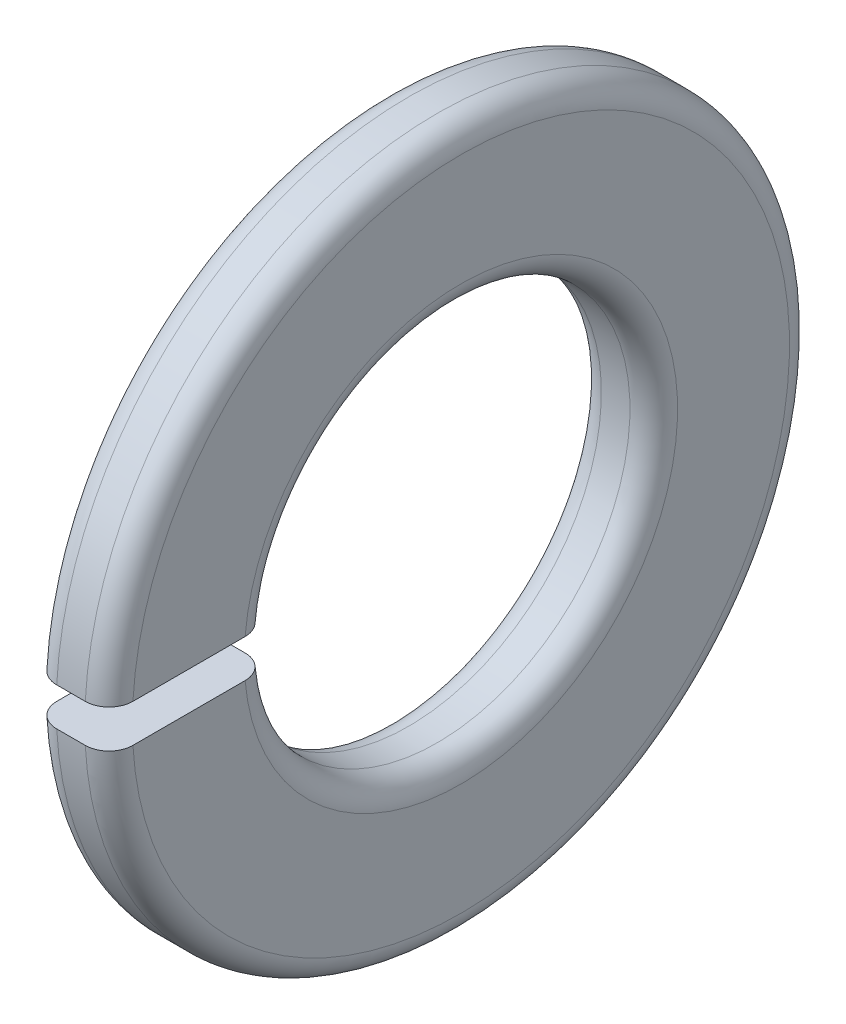
ISO-10303-21;
HEADER;
FILE_DESCRIPTION(('STEP AP214'),'2;1');
FILE_NAME('part.step','',(''),(''),'','','');
FILE_SCHEMA(('AUTOMOTIVE_DESIGN { 1 0 10303 214 1 1 1 1 }'));
ENDSEC;
DATA;
#1=APPLICATION_CONTEXT('core data for automotive mechanical design processes');
#2=APPLICATION_PROTOCOL_DEFINITION('international standard','automotive_design',2000,#1);
#3=PRODUCT_CONTEXT('',#1,'mechanical');
#4=PRODUCT('Part','Part','',(#3));
#5=PRODUCT_RELATED_PRODUCT_CATEGORY('part','',(#4));
#6=PRODUCT_DEFINITION_FORMATION('','',#4);
#7=PRODUCT_DEFINITION_CONTEXT('part definition',#1,'design');
#8=PRODUCT_DEFINITION('design','',#6,#7);
#9=PRODUCT_DEFINITION_SHAPE('','',#8);
#10=(LENGTH_UNIT() NAMED_UNIT(*) SI_UNIT(.MILLI.,.METRE.));
#11=(NAMED_UNIT(*) PLANE_ANGLE_UNIT() SI_UNIT($,.RADIAN.));
#12=(NAMED_UNIT(*) SI_UNIT($,.STERADIAN.) SOLID_ANGLE_UNIT());
#13=UNCERTAINTY_MEASURE_WITH_UNIT(LENGTH_MEASURE(1.E-05),#10,'distance_accuracy_value','');
#14=(GEOMETRIC_REPRESENTATION_CONTEXT(3) GLOBAL_UNCERTAINTY_ASSIGNED_CONTEXT((#13)) GLOBAL_UNIT_ASSIGNED_CONTEXT((#10,
#11,#12)) REPRESENTATION_CONTEXT('',''));
#15=CARTESIAN_POINT('',(0.,0.,0.));
#16=DIRECTION('',(0.,0.,1.));
#17=DIRECTION('',(1.,0.,0.));
#18=AXIS2_PLACEMENT_3D('',#15,#16,#17);
#19=CARTESIAN_POINT('',(-34.9250000000002,-2.22044604925031E-13,0.));
#20=DIRECTION('',(-1.,0.,0.));
#21=DIRECTION('',(0.,0.,1.));
#22=AXIS2_PLACEMENT_3D('',#19,#20,#21);
#23=CYLINDRICAL_SURFACE('',#22,7.4);
#24=DIRECTION('',(-1.,0.,0.));
#25=VECTOR('',#24,1.);
#26=CARTESIAN_POINT('',(-34.9250000000001,0.399999999999845,7.38918128076449));
#27=LINE('',#26,#25);
#28=CARTESIAN_POINT('',(-0.500000000000222,0.399999999999956,7.38918128076449));
#29=VERTEX_POINT('',#28);
#30=CARTESIAN_POINT('',(-1.10000000000027,0.399999999999845,7.38918128076449));
#31=VERTEX_POINT('',#30);
#32=EDGE_CURVE('E195',#29,#31,#27,.T.);
#33=ORIENTED_EDGE('',*,*,#32,.F.);
#34=CARTESIAN_POINT('',(-0.499999999999834,0.,0.));
#35=DIRECTION('',(-1.,0.,0.));
#36=DIRECTION('',(0.,0.,1.));
#37=AXIS2_PLACEMENT_3D('',#34,#35,#36);
#38=CIRCLE('',#37,7.4);
#39=CARTESIAN_POINT('',(-0.500000000000111,-0.4000000000004,7.38918128076449));
#40=VERTEX_POINT('',#39);
#41=EDGE_CURVE('E137',#29,#40,#38,.T.);
#42=ORIENTED_EDGE('',*,*,#41,.T.);
#43=DIRECTION('',(-1.,0.,0.));
#44=VECTOR('',#43,1.);
#45=CARTESIAN_POINT('',(-34.9250000000001,-0.400000000000178,7.38918128076449));
#46=LINE('',#45,#44);
#47=CARTESIAN_POINT('',(-1.09999999999993,-0.400000000000178,7.38918128076449));
#48=VERTEX_POINT('',#47);
#49=EDGE_CURVE('E120',#48,#40,#46,.F.);
#50=ORIENTED_EDGE('',*,*,#49,.F.);
#51=CARTESIAN_POINT('',(-1.09999999999988,-1.11022302462516E-13,0.));
#52=DIRECTION('',(1.,0.,0.));
#53=DIRECTION('',(0.,0.,-1.));
#54=AXIS2_PLACEMENT_3D('',#51,#52,#53);
#55=CIRCLE('',#54,7.4);
#56=EDGE_CURVE('E135',#48,#31,#55,.T.);
#57=ORIENTED_EDGE('',*,*,#56,.T.);
#58=EDGE_LOOP('',(#33,#42,#50,#57));
#59=FACE_BOUND('',#58,.T.);
#60=ADVANCED_FACE('F37',(#59),#23,.T.);
#61=CARTESIAN_POINT('',(2.22044604925031E-13,4.55000000000005,-1.11022302462516E-13));
#62=DIRECTION('',(-1.,0.,0.));
#63=DIRECTION('',(0.,0.,1.));
#64=AXIS2_PLACEMENT_3D('',#61,#62,#63);
#65=PLANE('',#64);
#66=DIRECTION('',(0.,0.,1.));
#67=VECTOR('',#66,1.);
#68=CARTESIAN_POINT('',(0.,-0.400000000000067,0.));
#69=LINE('',#68,#67);
#70=CARTESIAN_POINT('',(0.,-0.399999999999956,4.53238347892149));
#71=VERTEX_POINT('',#70);
#72=CARTESIAN_POINT('',(0.,-0.399999999999956,6.8883960397178));
#73=VERTEX_POINT('',#72);
#74=EDGE_CURVE('E101',#71,#73,#69,.T.);
#75=ORIENTED_EDGE('',*,*,#74,.T.);
#76=CARTESIAN_POINT('',(0.,0.,0.));
#77=DIRECTION('',(-1.,0.,0.));
#78=DIRECTION('',(0.,0.,1.));
#79=AXIS2_PLACEMENT_3D('',#76,#77,#78);
#80=CIRCLE('',#79,6.9);
#81=CARTESIAN_POINT('',(1.11022302462516E-13,0.399999999999956,6.8883960397178));
#82=VERTEX_POINT('',#81);
#83=EDGE_CURVE('E59',#73,#82,#80,.F.);
#84=ORIENTED_EDGE('',*,*,#83,.T.);
#85=DIRECTION('',(0.,0.,-1.));
#86=VECTOR('',#85,1.);
#87=CARTESIAN_POINT('',(1.11022302462516E-13,0.399999999999956,7.548));
#88=LINE('',#87,#86);
#89=CARTESIAN_POINT('',(1.11022302462516E-13,0.399999999999956,4.53238347892138));
#90=VERTEX_POINT('',#89);
#91=EDGE_CURVE('E110',#82,#90,#88,.T.);
#92=ORIENTED_EDGE('',*,*,#91,.T.);
#93=CARTESIAN_POINT('',(0.,0.,0.));
#94=DIRECTION('',(-1.,0.,0.));
#95=DIRECTION('',(0.,0.,1.));
#96=AXIS2_PLACEMENT_3D('',#93,#94,#95);
#97=CIRCLE('',#96,4.55);
#98=EDGE_CURVE('E117',#90,#71,#97,.T.);
#99=ORIENTED_EDGE('',*,*,#98,.T.);
#100=EDGE_LOOP('',(#75,#84,#92,#99));
#101=FACE_BOUND('',#100,.T.);
#102=ADVANCED_FACE('F123',(#101),#65,.F.);
#103=CARTESIAN_POINT('',(-0.499999999999834,0.,0.));
#104=DIRECTION('',(-1.,0.,0.));
#105=DIRECTION('',(0.,0.,1.));
#106=AXIS2_PLACEMENT_3D('',#103,#104,#105);
#107=TOROIDAL_SURFACE('',#106,4.55,0.5);
#108=ORIENTED_EDGE('',*,*,#98,.F.);
#109=CARTESIAN_POINT('',(-0.330409125838482,0.400000000000067,4.05998263665097));
#110=CARTESIAN_POINT('',(-0.356699409802146,0.4000000000001,4.05045896546512));
#111=CARTESIAN_POINT('',(-0.383811711798037,0.400000000000022,4.0431457229356));
#112=CARTESIAN_POINT('',(-0.438901460988715,0.39999999999989,4.0331697398659));
#113=CARTESIAN_POINT('',(-0.466879878970347,0.399999999999836,4.03051242528311));
#114=CARTESIAN_POINT('',(-0.522875623236489,0.399999999999854,4.02993732111443));
#115=CARTESIAN_POINT('',(-0.55089292694413,0.399999999999925,4.03201744362594));
#116=CARTESIAN_POINT('',(-0.606172773373835,0.399999999999987,4.04085230185844));
#117=CARTESIAN_POINT('',(-0.633435494454908,0.399999999999978,4.04760592293036));
#118=CARTESIAN_POINT('',(-0.686443389534853,0.399999999999933,4.06558912296169));
#119=CARTESIAN_POINT('',(-0.712188500806952,0.399999999999897,4.07681888678307));
#120=CARTESIAN_POINT('',(-0.761436770280269,0.400000000000015,4.10342912146019));
#121=CARTESIAN_POINT('',(-0.784939816128844,0.40000000000017,4.11880980017565));
#122=CARTESIAN_POINT('',(-0.829113401635823,0.400000000000186,4.15333154451043));
#123=CARTESIAN_POINT('',(-0.849775233099391,0.400000000000047,4.1724837518144));
#124=CARTESIAN_POINT('',(-0.887607999389916,0.399999999999865,4.21397126810759));
#125=CARTESIAN_POINT('',(-0.904778856858445,0.399999999999821,4.23630664761585));
#126=CARTESIAN_POINT('',(-0.935223661861778,0.399999999999869,4.28363431668719));
#127=CARTESIAN_POINT('',(-0.948479748232837,0.399999999999962,4.30863809632875));
#128=CARTESIAN_POINT('',(-0.970623347165116,0.39999999999995,4.36051051838913));
#129=CARTESIAN_POINT('',(-0.979510773610316,0.399999999999845,4.38737919755738));
#130=CARTESIAN_POINT('',(-0.992694264359808,0.399999999999845,4.44232245499128));
#131=CARTESIAN_POINT('',(-0.996973767275093,0.399999999999952,4.47040100828186));
#132=CARTESIAN_POINT('',(-1.00076411779757,0.39999999999996,4.52687835917844));
#133=CARTESIAN_POINT('',(-1.0002749143817,0.399999999999861,4.5552771602077));
#134=CARTESIAN_POINT('',(-0.99453592985803,0.399999999999829,4.61162260838542));
#135=CARTESIAN_POINT('',(-0.989280734484446,0.399999999999897,4.63956870449149));
#136=CARTESIAN_POINT('',(-0.974146548364361,0.400000000000015,4.69417974747737));
#137=CARTESIAN_POINT('',(-0.96426758016482,0.400000000000066,4.72084470060373));
#138=CARTESIAN_POINT('',(-0.940178144680834,0.400000000000068,4.77209438903106));
#139=CARTESIAN_POINT('',(-0.92597385676707,0.400000000000019,4.79668202848432));
#140=CARTESIAN_POINT('',(-0.893627088301629,0.399999999999892,4.84311401411117));
#141=CARTESIAN_POINT('',(-0.875484665198122,0.399999999999814,4.86495840029507));
#142=CARTESIAN_POINT('',(-0.83583473091054,0.399999999999876,4.90521248540845));
#143=CARTESIAN_POINT('',(-0.814337571269765,0.400000000000015,4.92363238020995));
#144=CARTESIAN_POINT('',(-0.768547265482445,0.399999999999897,4.956587365567));
#145=CARTESIAN_POINT('',(-0.744254170003945,0.399999999999638,4.97112252650596));
#146=CARTESIAN_POINT('',(-0.693647642204003,0.399999999999608,4.99584577571268));
#147=CARTESIAN_POINT('',(-0.66734111827875,0.399999999999833,5.00604800566672));
#148=CARTESIAN_POINT('',(-0.613386245709869,0.400000000000079,5.02187927836136));
#149=CARTESIAN_POINT('',(-0.585737916867112,0.400000000000098,5.02750838856528));
#150=CARTESIAN_POINT('',(-0.529954605037693,0.400000000000036,5.0340224915288));
#151=CARTESIAN_POINT('',(-0.501820931561369,0.399999999999954,5.03491870265947));
#152=CARTESIAN_POINT('',(-0.445803103473787,0.399999999999958,5.03197138887469));
#153=CARTESIAN_POINT('',(-0.417918947108474,0.400000000000045,5.02812789730478));
#154=CARTESIAN_POINT('',(-0.363212088788961,0.400000000000089,5.0158167420571));
#155=CARTESIAN_POINT('',(-0.336388641609307,0.400000000000045,5.00735238907735));
#156=CARTESIAN_POINT('',(-0.284541175591884,0.399999999999867,4.98604553307513));
#157=CARTESIAN_POINT('',(-0.259517162804965,0.399999999999733,4.97320301533129));
#158=CARTESIAN_POINT('',(-0.21194661877391,0.399999999999735,4.94349125113132));
#159=CARTESIAN_POINT('',(-0.18940295534485,0.399999999999871,4.92661741360181));
#160=CARTESIAN_POINT('',(-0.147459087564632,0.400000000000041,4.88933373674696));
#161=CARTESIAN_POINT('',(-0.128058917811661,0.400000000000075,4.86892385850806));
#162=CARTESIAN_POINT('',(-0.092896266127162,0.400000000000059,4.82509033772428));
#163=CARTESIAN_POINT('',(-0.0771436115465001,0.400000000000009,4.8016588122359));
#164=CARTESIAN_POINT('',(-0.0497804542347216,0.399999999999903,4.75249065234609));
#165=CARTESIAN_POINT('',(-0.0381700327053552,0.399999999999847,4.72675397276823));
#166=CARTESIAN_POINT('',(-0.0193802754353022,0.399999999999843,4.67361422413988));
#167=CARTESIAN_POINT('',(-0.0122158509543728,0.399999999999894,4.64620588245273));
#168=CARTESIAN_POINT('',(-0.00257598547450597,0.400000000000018,4.59057656902082));
#169=CARTESIAN_POINT('',(-0.000100635309112921,0.40000000000009,4.56235558154479));
#170=CARTESIAN_POINT('',(9.48808270901258E-05,0.400000000000044,4.50581794311796));
#171=CARTESIAN_POINT('',(-0.00219827880240896,0.399999999999924,4.4775012454532));
#172=CARTESIAN_POINT('',(-0.0115011713229525,0.399999999999988,4.4216543895494));
#173=CARTESIAN_POINT('',(-0.0185107660903179,0.40000000000017,4.39412420830136));
#174=CARTESIAN_POINT('',(-0.0370577853172879,0.400000000000185,4.34060850684111));
#175=CARTESIAN_POINT('',(-0.0485988845907034,0.400000000000017,4.31462426004419));
#176=CARTESIAN_POINT('',(-0.0758904922002047,0.399999999999895,4.26495974515578));
#177=CARTESIAN_POINT('',(-0.0916420238085095,0.39999999999994,4.24128003905364));
#178=CARTESIAN_POINT('',(-0.126885515624021,0.399999999999971,4.19694238067453));
#179=CARTESIAN_POINT('',(-0.146372741198713,0.399999999999957,4.176280661179));
#180=CARTESIAN_POINT('',(-0.188537988577971,0.399999999999955,4.1385587222439));
#181=CARTESIAN_POINT('',(-0.211212066622253,0.399999999999968,4.12149411562191));
#182=CARTESIAN_POINT('',(-0.250142838267282,0.399999999999949,4.0970633538218));
#183=CARTESIAN_POINT('',(-0.265634721029375,0.399999999999932,4.0884549780136));
#184=CARTESIAN_POINT('',(-0.29744424845304,0.39999999999998,4.07292985605947));
#185=CARTESIAN_POINT('',(-0.313761891790958,0.400000000000046,4.06601310720206));
#186=CARTESIAN_POINT('',(-0.330409125838482,0.400000000000067,4.05998263665097));
#187=B_SPLINE_CURVE_WITH_KNOTS('',3,(#109,#110,#111,#112,#113,#114,#115,#116,#117,#118,#119,
#120,#121,#122,#123,#124,#125,#126,#127,#128,#129,#130,#131,#132,#133,#134,#135,#136,#137,#138,
#139,#140,#141,#142,#143,#144,#145,#146,#147,#148,#149,#150,#151,#152,#153,#154,#155,#156,#157,
#158,#159,#160,#161,#162,#163,#164,#165,#166,#167,#168,#169,#170,#171,#172,#173,#174,#175,#176,
#177,#178,#179,#180,#181,#182,#183,#184,#185,#186),.UNSPECIFIED.,.T.,.F.,(4,2,2,2,2,2,2,2,2,2,2,
2,2,2,2,2,2,2,2,2,2,2,2,2,2,2,2,2,2,2,2,2,2,2,2,2,2,2,4),(0.,0.0838218122114619,
0.167741244452596,0.251623698536688,0.335486153194864,0.419352071680105,0.503222190583977,
0.587343895837374,0.671467464987133,0.755969120076795,0.840472440815555,0.925278472375903,
1.0100854113247,1.09498881356317,1.17989180179044,1.26467405791238,1.34945507734284,
1.43397948444906,1.5185023600422,1.60274721209049,1.68699082132428,1.77103465836219,
1.85507790412438,1.9390610144889,2.02304440724519,2.10712390438266,2.19120432686019,
2.27550871417561,2.3598147540508,2.4444020378726,2.52899096024471,2.6138165839882,
2.69863972366969,2.78353179303789,2.86844451273229,2.95325031685701,3.03795208220453,
3.09102886010444,3.14410555292756),.UNSPECIFIED.);
#188=CARTESIAN_POINT('',(-0.500000000000222,0.399999999999956,4.03019850627728));
#189=VERTEX_POINT('',#188);
#190=EDGE_CURVE('E189',#90,#189,#187,.T.);
#191=ORIENTED_EDGE('',*,*,#190,.T.);
#192=CARTESIAN_POINT('',(-0.499999999999834,0.,0.));
#193=DIRECTION('',(-1.,0.,0.));
#194=DIRECTION('',(0.,0.,1.));
#195=AXIS2_PLACEMENT_3D('',#192,#193,#194);
#196=CIRCLE('',#195,4.05);
#197=CARTESIAN_POINT('',(-0.500000000000111,-0.4000000000004,4.03019850627739));
#198=VERTEX_POINT('',#197);
#199=EDGE_CURVE('E119',#189,#198,#196,.T.);
#200=ORIENTED_EDGE('',*,*,#199,.T.);
#201=CARTESIAN_POINT('',(-0.330409125838371,-0.400000000000067,4.05998263665108));
#202=CARTESIAN_POINT('',(-0.303998054884027,-0.400000000000035,4.06955274934159));
#203=CARTESIAN_POINT('',(-0.278378187570875,-0.400000000000031,4.08136780490119));
#204=CARTESIAN_POINT('',(-0.229468009968222,-0.400000000000103,4.10914708906309));
#205=CARTESIAN_POINT('',(-0.206180642099356,-0.40000000000018,4.12511646922178));
#206=CARTESIAN_POINT('',(-0.162628404581075,-0.400000000000176,4.16072554719726));
#207=CARTESIAN_POINT('',(-0.142361525598668,-0.400000000000094,4.18036278525754));
#208=CARTESIAN_POINT('',(-0.105404865002197,-0.40000000000004,4.22274546756481));
#209=CARTESIAN_POINT('',(-0.0887142122853309,-0.400000000000067,4.24549015267942));
#210=CARTESIAN_POINT('',(-0.0593145355067375,-0.400000000000067,4.293528114128));
#211=CARTESIAN_POINT('',(-0.0466191936023909,-0.400000000000039,4.31882976448981));
#212=CARTESIAN_POINT('',(-0.0256391123932713,-0.400000000000095,4.37120120069832));
#213=CARTESIAN_POINT('',(-0.0173546375117452,-0.400000000000177,4.39827109243861));
#214=CARTESIAN_POINT('',(-0.00540643738012245,-0.400000000000179,4.45350983104994));
#215=CARTESIAN_POINT('',(-0.00175868436301207,-0.400000000000097,4.48168213385898));
#216=CARTESIAN_POINT('',(0.000760449795046994,-0.400000000000037,4.53823962205999));
#217=CARTESIAN_POINT('',(-0.000368202658097897,-0.400000000000059,4.56662480894785));
#218=CARTESIAN_POINT('',(-0.00737611087103522,-0.400000000000075,4.62283053010408));
#219=CARTESIAN_POINT('',(-0.0132599122059511,-0.400000000000069,4.65065049796667));
#220=CARTESIAN_POINT('',(-0.0296218450397377,-0.400000000000065,4.70490507320091));
#221=CARTESIAN_POINT('',(-0.0400999430070604,-0.400000000000066,4.73133969068198));
#222=CARTESIAN_POINT('',(-0.065338452584533,-0.400000000000068,4.7820273540892));
#223=CARTESIAN_POINT('',(-0.0800921296555753,-0.400000000000067,4.80628375286193));
#224=CARTESIAN_POINT('',(-0.113474295281597,-0.400000000000067,4.85196527308262));
#225=CARTESIAN_POINT('',(-0.132102729380802,-0.400000000000067,4.87339043431382));
#226=CARTESIAN_POINT('',(-0.172644592066143,-0.400000000000067,4.91273005629594));
#227=CARTESIAN_POINT('',(-0.194547702455967,-0.400000000000067,4.93065515030471));
#228=CARTESIAN_POINT('',(-0.241060668382995,-0.400000000000067,4.96255932206554));
#229=CARTESIAN_POINT('',(-0.265670473924019,-0.400000000000066,4.97653847268729));
#230=CARTESIAN_POINT('',(-0.316811816693902,-0.400000000000068,5.00010680296157));
#231=CARTESIAN_POINT('',(-0.343336826025212,-0.400000000000069,5.00971014847021));
#232=CARTESIAN_POINT('',(-0.397624666244413,-0.400000000000065,5.02431588077922));
#233=CARTESIAN_POINT('',(-0.425387479486394,-0.400000000000059,5.02931833314713));
#234=CARTESIAN_POINT('',(-0.481295047849626,-0.400000000000075,5.03457129491463));
#235=CARTESIAN_POINT('',(-0.509438788763203,-0.400000000000097,5.03483260397829));
#236=CARTESIAN_POINT('',(-0.565370027638215,-0.400000000000037,5.03062343748659));
#237=CARTESIAN_POINT('',(-0.593157527851018,-0.399999999999957,5.02615299184989));
#238=CARTESIAN_POINT('',(-0.647570925373874,-0.399999999999955,5.01261353673072));
#239=CARTESIAN_POINT('',(-0.674197500030792,-0.400000000000035,5.00354724878463));
#240=CARTESIAN_POINT('',(-0.725553341444044,-0.400000000000099,4.98107859095184));
#241=CARTESIAN_POINT('',(-0.750282601249112,-0.400000000000083,4.96767620517975));
#242=CARTESIAN_POINT('',(-0.797176902735528,-0.400000000000051,4.93690019753367));
#243=CARTESIAN_POINT('',(-0.81933866887635,-0.400000000000035,4.91952158513654));
#244=CARTESIAN_POINT('',(-0.860439937091133,-0.400000000000099,4.8812996704142));
#245=CARTESIAN_POINT('',(-0.879379399035982,-0.400000000000178,4.86045632494718));
#246=CARTESIAN_POINT('',(-0.913555037649893,-0.400000000000178,4.81583644954747));
#247=CARTESIAN_POINT('',(-0.92878092311603,-0.400000000000097,4.79205203768353));
#248=CARTESIAN_POINT('',(-0.95503894281943,-0.400000000000037,4.74227124767213));
#249=CARTESIAN_POINT('',(-0.966071000022536,-0.400000000000058,4.71627482890424));
#250=CARTESIAN_POINT('',(-0.983666717545373,-0.400000000000076,4.66271495586837));
#251=CARTESIAN_POINT('',(-0.990215319737374,-0.400000000000071,4.6351465544519));
#252=CARTESIAN_POINT('',(-0.998605003886596,-0.400000000000063,4.57930250605778));
#253=CARTESIAN_POINT('',(-1.00044600981606,-0.400000000000059,4.55102684766537));
#254=CARTESIAN_POINT('',(-0.999370123142739,-0.400000000000075,4.49448976015602));
#255=CARTESIAN_POINT('',(-0.996440401198292,-0.400000000000097,4.46622857452436));
#256=CARTESIAN_POINT('',(-0.985881872782638,-0.400000000000037,4.41059778472309));
#257=CARTESIAN_POINT('',(-0.97825301620438,-0.399999999999957,4.38322819006384));
#258=CARTESIAN_POINT('',(-0.958501856157571,-0.399999999999955,4.33013753544732));
#259=CARTESIAN_POINT('',(-0.946376172913414,-0.400000000000035,4.30441773255746));
#260=CARTESIAN_POINT('',(-0.917971024976038,-0.400000000000099,4.25538396733513));
#261=CARTESIAN_POINT('',(-0.901691578202966,-0.400000000000084,4.23206999462402));
#262=CARTESIAN_POINT('',(-0.865470563103995,-0.40000000000005,4.18856023044497));
#263=CARTESIAN_POINT('',(-0.845536004549954,-0.400000000000031,4.16835860431365));
#264=CARTESIAN_POINT('',(-0.802546772637584,-0.400000000000103,4.13160624609184));
#265=CARTESIAN_POINT('',(-0.779492288690146,-0.400000000000193,4.11505529252905));
#266=CARTESIAN_POINT('',(-0.731019776813271,-0.400000000000163,4.08614782469133));
#267=CARTESIAN_POINT('',(-0.705612044343357,-0.400000000000042,4.07377404617397));
#268=CARTESIAN_POINT('',(-0.65306641519147,-0.400000000000092,4.05348603352323));
#269=CARTESIAN_POINT('',(-0.625928131435694,-0.400000000000262,4.04557280100583));
#270=CARTESIAN_POINT('',(-0.570813894403548,-0.400000000000316,4.0344647130951));
#271=CARTESIAN_POINT('',(-0.542841556597716,-0.400000000000202,4.03125186183301));
#272=CARTESIAN_POINT('',(-0.486779048283169,-0.399999999999932,4.02958609117775));
#273=CARTESIAN_POINT('',(-0.458689065304752,-0.399999999999775,4.03112731488524));
#274=CARTESIAN_POINT('',(-0.413813775184463,-0.399999999999888,4.03741323322332));
#275=CARTESIAN_POINT('',(-0.396812255840598,-0.400000000000017,4.04070793348071));
#276=CARTESIAN_POINT('',(-0.363243484125702,-0.400000000000117,4.0490454261526));
#277=CARTESIAN_POINT('',(-0.346676230524988,-0.400000000000087,4.05408821361658));
#278=CARTESIAN_POINT('',(-0.330409125838371,-0.400000000000067,4.05998263665108));
#279=B_SPLINE_CURVE_WITH_KNOTS('',3,(#201,#202,#203,#204,#205,#206,#207,#208,#209,#210,#211,
#212,#213,#214,#215,#216,#217,#218,#219,#220,#221,#222,#223,#224,#225,#226,#227,#228,#229,#230,
#231,#232,#233,#234,#235,#236,#237,#238,#239,#240,#241,#242,#243,#244,#245,#246,#247,#248,#249,
#250,#251,#252,#253,#254,#255,#256,#257,#258,#259,#260,#261,#262,#263,#264,#265,#266,#267,#268,
#269,#270,#271,#272,#273,#274,#275,#276,#277,#278),.UNSPECIFIED.,.T.,.F.,(4,2,2,2,2,2,2,2,2,2,2,
2,2,2,2,2,2,2,2,2,2,2,2,2,2,2,2,2,2,2,2,2,2,2,2,2,2,2,4),(0.,0.0842109589616542,
0.168526845387917,0.25278638919668,0.337025385542433,0.421549800376598,0.506079281721338,
0.590899161728074,0.675719638303031,0.760621293101273,0.845522328253734,0.930290354476846,
1.01505718945191,1.0995623517658,1.18406595342153,1.2682940120919,1.35252087040592,
1.43655584752061,1.5205902932893,1.60457503411101,1.68856008261615,1.77265112384469,
1.85674321222817,1.9410657573615,2.02538985129511,2.10999578473066,2.19460308454476,
2.27943828451211,2.36427438909607,2.44917438540723,2.53407401544942,2.6188124964183,
2.703545835214,2.78792455681554,2.872322218126,2.95639590139369,3.04036604940957,
3.09223340332936,3.14410061036378),.UNSPECIFIED.);
#280=EDGE_CURVE('E105',#198,#71,#279,.T.);
#281=ORIENTED_EDGE('',*,*,#280,.T.);
#282=EDGE_LOOP('',(#108,#191,#200,#281));
#283=FACE_BOUND('',#282,.T.);
#284=ADVANCED_FACE('F115',(#283),#107,.T.);
#285=CARTESIAN_POINT('',(-34.9250000000002,-2.22044604925031E-13,0.));
#286=DIRECTION('',(-1.,0.,0.));
#287=DIRECTION('',(0.,0.,1.));
#288=AXIS2_PLACEMENT_3D('',#285,#286,#287);
#289=CYLINDRICAL_SURFACE('',#288,4.05);
#290=DIRECTION('',(-1.,0.,0.));
#291=VECTOR('',#290,1.);
#292=CARTESIAN_POINT('',(-34.925,0.399999999999845,4.03019850627739));
#293=LINE('',#292,#291);
#294=CARTESIAN_POINT('',(-1.10000000000032,0.399999999999845,4.03019850627728));
#295=VERTEX_POINT('',#294);
#296=EDGE_CURVE('E196',#295,#189,#293,.F.);
#297=ORIENTED_EDGE('',*,*,#296,.F.);
#298=CARTESIAN_POINT('',(-1.09999999999988,-1.11022302462516E-13,0.));
#299=DIRECTION('',(-1.,0.,0.));
#300=DIRECTION('',(0.,0.,1.));
#301=AXIS2_PLACEMENT_3D('',#298,#299,#300);
#302=CIRCLE('',#301,4.05);
#303=CARTESIAN_POINT('',(-1.09999999999999,-0.400000000000178,4.03019850627739));
#304=VERTEX_POINT('',#303);
#305=EDGE_CURVE('E130',#295,#304,#302,.T.);
#306=ORIENTED_EDGE('',*,*,#305,.T.);
#307=DIRECTION('',(-1.,0.,0.));
#308=VECTOR('',#307,1.);
#309=CARTESIAN_POINT('',(-34.9250000000001,-0.400000000000178,4.03019850627739));
#310=LINE('',#309,#308);
#311=EDGE_CURVE('E121',#198,#304,#310,.T.);
#312=ORIENTED_EDGE('',*,*,#311,.F.);
#313=ORIENTED_EDGE('',*,*,#199,.F.);
#314=EDGE_LOOP('',(#297,#306,#312,#313));
#315=FACE_BOUND('',#314,.T.);
#316=ADVANCED_FACE('F201',(#315),#289,.F.);
#317=CARTESIAN_POINT('',(-1.09999999999988,-1.11022302462516E-13,0.));
#318=DIRECTION('',(-1.,0.,0.));
#319=DIRECTION('',(0.,0.,1.));
#320=AXIS2_PLACEMENT_3D('',#317,#318,#319);
#321=TOROIDAL_SURFACE('',#320,4.55,0.5);
#322=ORIENTED_EDGE('',*,*,#305,.F.);
#323=CARTESIAN_POINT('',(-1.26959087416145,0.400000000000067,4.05998263665108));
#324=CARTESIAN_POINT('',(-1.29600194511586,0.400000000000114,4.06955274934163));
#325=CARTESIAN_POINT('',(-1.32162181242902,0.400000000000024,4.08136780490138));
#326=CARTESIAN_POINT('',(-1.37053199003191,0.399999999999887,4.10914708906324));
#327=CARTESIAN_POINT('',(-1.39381935790101,0.39999999999984,4.12511646922172));
#328=CARTESIAN_POINT('',(-1.43737159541921,0.39999999999985,4.16072554719723));
#329=CARTESIAN_POINT('',(-1.45763847440131,0.399999999999906,4.18036278525774));
#330=CARTESIAN_POINT('',(-1.49459513499763,0.400000000000006,4.22274546756505));
#331=CARTESIAN_POINT('',(-1.51128578771464,0.40000000000005,4.24549015267948));
#332=CARTESIAN_POINT('',(-1.54068546449319,0.400000000000084,4.29352811412799));
#333=CARTESIAN_POINT('',(-1.55338080639733,0.400000000000073,4.3188297644899));
#334=CARTESIAN_POINT('',(-1.57436088760651,0.399999999999839,4.37120120069844));
#335=CARTESIAN_POINT('',(-1.58264536248831,0.399999999999616,4.39827109243864));
#336=CARTESIAN_POINT('',(-1.59459356261991,0.399999999999629,4.45350983104989));
#337=CARTESIAN_POINT('',(-1.59824131563674,0.399999999999867,4.48168213385894));
#338=CARTESIAN_POINT('',(-1.60076044979471,0.400000000000045,4.53823962205994));
#339=CARTESIAN_POINT('',(-1.59963179734176,0.399999999999986,4.56662480894778));
#340=CARTESIAN_POINT('',(-1.59262388912887,0.399999999999926,4.62283053010395));
#341=CARTESIAN_POINT('',(-1.5867400877938,0.399999999999924,4.6506504979665));
#342=CARTESIAN_POINT('',(-1.57037815496003,0.399999999999988,4.70490507320075));
#343=CARTESIAN_POINT('',(-1.55990005699287,0.400000000000053,4.73133969068189));
#344=CARTESIAN_POINT('',(-1.53466154741542,0.400000000000081,4.78202735408904));
#345=CARTESIAN_POINT('',(-1.51990787034423,0.400000000000043,4.80628375286164));
#346=CARTESIAN_POINT('',(-1.48652570471839,0.399999999999869,4.85196527308242));
#347=CARTESIAN_POINT('',(-1.4678972706195,0.399999999999733,4.87339043431384));
#348=CARTESIAN_POINT('',(-1.42735540793426,0.399999999999735,4.91273005629597));
#349=CARTESIAN_POINT('',(-1.4054522975442,0.399999999999871,4.93065515030452));
#350=CARTESIAN_POINT('',(-1.35893933161697,0.400000000000041,4.96255932206524));
#351=CARTESIAN_POINT('',(-1.33432952607598,0.400000000000076,4.97653847268712));
#352=CARTESIAN_POINT('',(-1.28318818330612,0.400000000000058,5.0001068029615));
#353=CARTESIAN_POINT('',(-1.2566631739748,0.400000000000007,5.00971014847011));
#354=CARTESIAN_POINT('',(-1.20237533375562,0.399999999999905,5.02431588077915));
#355=CARTESIAN_POINT('',(-1.17461252051368,0.399999999999854,5.0293183331471));
#356=CARTESIAN_POINT('',(-1.11870495215046,0.399999999999836,5.03457129491467));
#357=CARTESIAN_POINT('',(-1.09056121123685,0.399999999999869,5.03483260397835));
#358=CARTESIAN_POINT('',(-1.03462997236179,0.400000000000043,5.03062343748658));
#359=CARTESIAN_POINT('',(-1.00684247214897,0.400000000000186,5.02615299184978));
#360=CARTESIAN_POINT('',(-0.952429074626014,0.40000000000017,5.01261353673061));
#361=CARTESIAN_POINT('',(-0.925802499969019,0.400000000000013,5.00354724878463));
#362=CARTESIAN_POINT('',(-0.874446658555696,0.399999999999899,4.9810785909519));
#363=CARTESIAN_POINT('',(-0.849717398750631,0.399999999999941,4.96767620517976));
#364=CARTESIAN_POINT('',(-0.802823097264214,0.399999999999971,4.9369001975337));
#365=CARTESIAN_POINT('',(-0.780661331123381,0.399999999999958,4.91952158513665));
#366=CARTESIAN_POINT('',(-0.739560062908779,0.399999999999954,4.88129967041429));
#367=CARTESIAN_POINT('',(-0.720620600964121,0.399999999999963,4.86045632494715));
#368=CARTESIAN_POINT('',(-0.686444962350165,0.399999999999949,4.81583644954744));
#369=CARTESIAN_POINT('',(-0.671219076883798,0.399999999999925,4.79205203768362));
#370=CARTESIAN_POINT('',(-0.644961057180276,0.399999999999987,4.74227124767225));
#371=CARTESIAN_POINT('',(-0.633928999977277,0.400000000000074,4.71627482890428));
#372=CARTESIAN_POINT('',(-0.616333282454468,0.40000000000006,4.66271495586835));
#373=CARTESIAN_POINT('',(-0.609784680262385,0.399999999999958,4.6351465544519));
#374=CARTESIAN_POINT('',(-0.601394996113074,0.399999999999953,4.5793025060578));
#375=CARTESIAN_POINT('',(-0.599553990183602,0.40000000000005,4.55102684766539));
#376=CARTESIAN_POINT('',(-0.600629876856911,0.400000000000084,4.494489760156));
#377=CARTESIAN_POINT('',(-0.60355959880135,0.400000000000022,4.46622857452432));
#378=CARTESIAN_POINT('',(-0.614118127217157,0.39999999999989,4.41059778472308));
#379=CARTESIAN_POINT('',(-0.621746983795575,0.399999999999819,4.38322819006387));
#380=CARTESIAN_POINT('',(-0.641498143842354,0.399999999999871,4.33013753544725));
#381=CARTESIAN_POINT('',(-0.653623827086323,0.399999999999995,4.30441773255725));
#382=CARTESIAN_POINT('',(-0.682028975023866,0.399999999999917,4.25538396733496));
#383=CARTESIAN_POINT('',(-0.698308421797293,0.399999999999717,4.23206999462406));
#384=CARTESIAN_POINT('',(-0.734529436896345,0.399999999999751,4.18856023044499));
#385=CARTESIAN_POINT('',(-0.754463995450104,0.399999999999986,4.16835860431345));
#386=CARTESIAN_POINT('',(-0.797453227362298,0.399999999999926,4.1316062460916));
#387=CARTESIAN_POINT('',(-0.820507711309842,0.399999999999631,4.115055292529));
#388=CARTESIAN_POINT('',(-0.86898022318671,0.399999999999614,4.08614782469139));
#389=CARTESIAN_POINT('',(-0.894387955656511,0.399999999999889,4.07377404617395));
#390=CARTESIAN_POINT('',(-0.946933584808257,0.400000000000023,4.05348603352317));
#391=CARTESIAN_POINT('',(-0.974071868564004,0.399999999999881,4.04557280100581));
#392=CARTESIAN_POINT('',(-1.02918610559616,0.399999999999809,4.03446471309511));
#393=CARTESIAN_POINT('',(-1.05715844340204,0.399999999999879,4.03125186183302));
#394=CARTESIAN_POINT('',(-1.11322095171668,0.400000000000033,4.02958609117774));
#395=CARTESIAN_POINT('',(-1.14131093469515,0.400000000000116,4.03112731488521));
#396=CARTESIAN_POINT('',(-1.18618622481545,0.400000000000037,4.03741323322334));
#397=CARTESIAN_POINT('',(-1.20318774415928,0.399999999999956,4.04070793348075));
#398=CARTESIAN_POINT('',(-1.23675651587415,0.399999999999956,4.04904542615263));
#399=CARTESIAN_POINT('',(-1.25332376947486,0.400000000000038,4.05408821361658));
#400=CARTESIAN_POINT('',(-1.26959087416145,0.400000000000067,4.05998263665108));
#401=B_SPLINE_CURVE_WITH_KNOTS('',3,(#323,#324,#325,#326,#327,#328,#329,#330,#331,#332,#333,
#334,#335,#336,#337,#338,#339,#340,#341,#342,#343,#344,#345,#346,#347,#348,#349,#350,#351,#352,
#353,#354,#355,#356,#357,#358,#359,#360,#361,#362,#363,#364,#365,#366,#367,#368,#369,#370,#371,
#372,#373,#374,#375,#376,#377,#378,#379,#380,#381,#382,#383,#384,#385,#386,#387,#388,#389,#390,
#391,#392,#393,#394,#395,#396,#397,#398,#399,#400),.UNSPECIFIED.,.T.,.F.,(4,2,2,2,2,2,2,2,2,2,2,
2,2,2,2,2,2,2,2,2,2,2,2,2,2,2,2,2,2,2,2,2,2,2,2,2,2,2,4),(0.,0.084210958961904,
0.168526845388365,0.252786389196926,0.337025385542534,0.42154980037672,0.506079281721438,
0.590899161728083,0.67571963830297,0.760621293101183,0.845522328253631,0.930290354476655,
1.01505718945158,1.09956235176555,1.18406595342142,1.26829401209178,1.35252087040573,
1.43655584752048,1.5205902932893,1.60457503411112,1.68856008261631,1.7726511238447,
1.85674321222808,1.9410657573615,2.02538985129518,2.10999578473075,2.19460308454486,
2.27943828451224,2.36427438909623,2.44917438540751,2.53407401544984,2.61881249641864,
2.70354583521422,2.7879245568156,2.87232221812592,2.95639590139375,3.04036604940977,
3.09223340332949,3.14410061036386),.UNSPECIFIED.);
#402=CARTESIAN_POINT('',(-1.59999999999993,0.399999999999956,4.53238347892138));
#403=VERTEX_POINT('',#402);
#404=EDGE_CURVE('E181',#295,#403,#401,.T.);
#405=ORIENTED_EDGE('',*,*,#404,.T.);
#406=CARTESIAN_POINT('',(-1.60000000000005,-2.22044604925031E-13,0.));
#407=DIRECTION('',(-1.,0.,0.));
#408=DIRECTION('',(0.,0.,1.));
#409=AXIS2_PLACEMENT_3D('',#406,#407,#408);
#410=CIRCLE('',#409,4.55);
#411=CARTESIAN_POINT('',(-1.60000000000005,-0.400000000000067,4.53238347892149));
#412=VERTEX_POINT('',#411);
#413=EDGE_CURVE('E239',#403,#412,#410,.T.);
#414=ORIENTED_EDGE('',*,*,#413,.T.);
#415=CARTESIAN_POINT('',(-1.26959087416134,-0.400000000000067,4.05998263665108));
#416=CARTESIAN_POINT('',(-1.2433005901977,-0.400000000000067,4.05045896546526));
#417=CARTESIAN_POINT('',(-1.21618828820186,-0.400000000000069,4.04314572293567));
#418=CARTESIAN_POINT('',(-1.16109853901127,-0.400000000000065,4.03316973986591));
#419=CARTESIAN_POINT('',(-1.13312012102967,-0.400000000000059,4.03051242528312));
#420=CARTESIAN_POINT('',(-1.07712437676353,-0.400000000000074,4.02993732111442));
#421=CARTESIAN_POINT('',(-1.04910707305585,-0.400000000000095,4.0320174436259));
#422=CARTESIAN_POINT('',(-0.993827226626095,-0.400000000000039,4.04085230185841));
#423=CARTESIAN_POINT('',(-0.966564505545003,-0.399999999999963,4.04760592293036));
#424=CARTESIAN_POINT('',(-0.913556610465009,-0.399999999999949,4.06558912296169));
#425=CARTESIAN_POINT('',(-0.887811499192879,-0.400000000000012,4.07681888678302));
#426=CARTESIAN_POINT('',(-0.838563229719523,-0.400000000000122,4.10342912146014));
#427=CARTESIAN_POINT('',(-0.815060183870942,-0.40000000000017,4.11880980017563));
#428=CARTESIAN_POINT('',(-0.770886598363921,-0.400000000000186,4.15333154451046));
#429=CARTESIAN_POINT('',(-0.750224766900318,-0.400000000000154,4.17248375181443));
#430=CARTESIAN_POINT('',(-0.712392000609748,-0.39999999999998,4.21397126810762));
#431=CARTESIAN_POINT('',(-0.695221143141206,-0.399999999999837,4.23630664761586));
#432=CARTESIAN_POINT('',(-0.664776338137813,-0.399999999999852,4.28363431668712));
#433=CARTESIAN_POINT('',(-0.651520251766695,-0.400000000000011,4.3086380963286));
#434=CARTESIAN_POINT('',(-0.629376652834882,-0.400000000000123,4.36051051838903));
#435=CARTESIAN_POINT('',(-0.620489226390213,-0.400000000000076,4.38737919755739));
#436=CARTESIAN_POINT('',(-0.607305735640627,-0.400000000000058,4.44232245499134));
#437=CARTESIAN_POINT('',(-0.603026232724724,-0.400000000000088,4.47040100828186));
#438=CARTESIAN_POINT('',(-0.599235882202037,-0.400000000000046,4.52687835917839));
#439=CARTESIAN_POINT('',(-0.59972508561832,-0.399999999999974,4.55527716020767));
#440=CARTESIAN_POINT('',(-0.605464070142045,-0.399999999999938,4.61162260838545));
#441=CARTESIAN_POINT('',(-0.610719265515281,-0.399999999999975,4.63956870449159));
#442=CARTESIAN_POINT('',(-0.625853451635383,-0.400000000000159,4.69417974747743));
#443=CARTESIAN_POINT('',(-0.635732419835293,-0.400000000000306,4.72084470060369));
#444=CARTESIAN_POINT('',(-0.659821855319355,-0.400000000000272,4.77209438903108));
#445=CARTESIAN_POINT('',(-0.674026143232821,-0.400000000000092,4.7966820284845));
#446=CARTESIAN_POINT('',(-0.706372911698152,-0.400000000000042,4.84311401411135));
#447=CARTESIAN_POINT('',(-0.724515334801844,-0.400000000000172,4.86495840029509));
#448=CARTESIAN_POINT('',(-0.764165269089491,-0.400000000000184,4.90521248540845));
#449=CARTESIAN_POINT('',(-0.785662428730151,-0.400000000000067,4.92363238021009));
#450=CARTESIAN_POINT('',(-0.831452734517459,-0.400000000000067,4.95658736556714));
#451=CARTESIAN_POINT('',(-0.855745829996064,-0.400000000000184,4.97112252650598));
#452=CARTESIAN_POINT('',(-0.90635235779606,-0.400000000000172,4.99584577571265));
#453=CARTESIAN_POINT('',(-0.932658881721261,-0.400000000000044,5.00604800566678));
#454=CARTESIAN_POINT('',(-0.986613754290107,-0.40000000000009,5.02187927836146));
#455=CARTESIAN_POINT('',(-1.01426208313288,-0.400000000000264,5.02750838856531));
#456=CARTESIAN_POINT('',(-1.07004539496235,-0.400000000000314,5.03402249152877));
#457=CARTESIAN_POINT('',(-1.09817906843872,-0.40000000000019,5.03491870265943));
#458=CARTESIAN_POINT('',(-1.1541968965264,-0.399999999999944,5.03197138887468));
#459=CARTESIAN_POINT('',(-1.18208105289176,-0.39999999999982,5.02812789730483));
#460=CARTESIAN_POINT('',(-1.23678791121121,-0.399999999999869,5.01581674205708));
#461=CARTESIAN_POINT('',(-1.26361135839075,-0.400000000000041,5.00735238907725));
#462=CARTESIAN_POINT('',(-1.31545882440801,-0.400000000000092,4.98604553307502));
#463=CARTESIAN_POINT('',(-1.34048283719488,-0.399999999999971,4.97320301533125));
#464=CARTESIAN_POINT('',(-1.38805338122587,-0.399999999999941,4.9434912511313));
#465=CARTESIAN_POINT('',(-1.41059704465491,-0.400000000000031,4.92661741360173));
#466=CARTESIAN_POINT('',(-1.45254091243521,-0.400000000000103,4.88933373674689));
#467=CARTESIAN_POINT('',(-1.47194108218828,-0.400000000000084,4.86892385850807));
#468=CARTESIAN_POINT('',(-1.50710373387273,-0.40000000000005,4.82509033772431));
#469=CARTESIAN_POINT('',(-1.52285638845323,-0.400000000000035,4.80165881223589));
#470=CARTESIAN_POINT('',(-1.55021954576497,-0.400000000000099,4.7524906523461));
#471=CARTESIAN_POINT('',(-1.56182996729446,-0.400000000000178,4.7267539727683));
#472=CARTESIAN_POINT('',(-1.58061972456444,-0.400000000000177,4.67361422413997));
#473=CARTESIAN_POINT('',(-1.58778414904517,-0.400000000000097,4.64620588245275));
#474=CARTESIAN_POINT('',(-1.59742401452537,-0.400000000000037,4.59057656902079));
#475=CARTESIAN_POINT('',(-1.5998993646913,-0.400000000000059,4.56235558154477));
#476=CARTESIAN_POINT('',(-1.60009488082744,-0.400000000000075,4.50581794311802));
#477=CARTESIAN_POINT('',(-1.59780172119736,-0.400000000000069,4.47750124545333));
#478=CARTESIAN_POINT('',(-1.58849882867674,-0.400000000000065,4.42165438954949));
#479=CARTESIAN_POINT('',(-1.58148923390989,-0.400000000000066,4.39412420830134));
#480=CARTESIAN_POINT('',(-1.56294221468304,-0.400000000000068,4.34060850684114));
#481=CARTESIAN_POINT('',(-1.55140111540921,-0.400000000000067,4.31462426004438));
#482=CARTESIAN_POINT('',(-1.52410950779954,-0.400000000000067,4.26495974515603));
#483=CARTESIAN_POINT('',(-1.50835797619147,-0.400000000000067,4.24128003905377));
#484=CARTESIAN_POINT('',(-1.47311448437606,-0.400000000000067,4.19694238067459));
#485=CARTESIAN_POINT('',(-1.45362725880124,-0.400000000000067,4.17628066117912));
#486=CARTESIAN_POINT('',(-1.41146201142182,-0.400000000000067,4.13855872224407));
#487=CARTESIAN_POINT('',(-1.38878793337752,-0.400000000000067,4.12149411562207));
#488=CARTESIAN_POINT('',(-1.34985716173251,-0.400000000000067,4.09706335382189));
#489=CARTESIAN_POINT('',(-1.33436527897044,-0.400000000000067,4.08845497801365));
#490=CARTESIAN_POINT('',(-1.30255575154679,-0.400000000000067,4.07292985605953));
#491=CARTESIAN_POINT('',(-1.28623810820886,-0.400000000000067,4.06601310720216));
#492=CARTESIAN_POINT('',(-1.26959087416134,-0.400000000000067,4.05998263665108));
#493=B_SPLINE_CURVE_WITH_KNOTS('',3,(#415,#416,#417,#418,#419,#420,#421,#422,#423,#424,#425,
#426,#427,#428,#429,#430,#431,#432,#433,#434,#435,#436,#437,#438,#439,#440,#441,#442,#443,#444,
#445,#446,#447,#448,#449,#450,#451,#452,#453,#454,#455,#456,#457,#458,#459,#460,#461,#462,#463,
#464,#465,#466,#467,#468,#469,#470,#471,#472,#473,#474,#475,#476,#477,#478,#479,#480,#481,#482,
#483,#484,#485,#486,#487,#488,#489,#490,#491,#492),.UNSPECIFIED.,.T.,.F.,(4,2,2,2,2,2,2,2,2,2,2,
2,2,2,2,2,2,2,2,2,2,2,2,2,2,2,2,2,2,2,2,2,2,2,2,2,2,2,4),(0.,0.0838218122113641,0.1677412444524,
0.251623698536581,0.335486153194839,0.419352071680116,0.503222190584058,0.587343895837547,
0.671467464987323,0.755969120076783,0.840472440815448,0.925278472375911,1.01008541132472,
1.0949888135632,1.17989180179055,1.26467405791248,1.34945507734291,1.43397948444915,
1.51850236004234,1.60274721209061,1.68699082132438,1.77103465836243,1.85507790412476,
1.93906101448902,2.02304440724508,2.10712390438263,2.19120432686019,2.27550871417548,
2.3598147540506,2.4444020378725,2.52899096024466,2.61381658398809,2.69863972366956,
2.78353179303774,2.8684445127321,2.95325031685692,3.03795208220454,3.09102886010444,
3.14410555292753),.UNSPECIFIED.);
#494=EDGE_CURVE('E109',#412,#304,#493,.T.);
#495=ORIENTED_EDGE('',*,*,#494,.T.);
#496=EDGE_LOOP('',(#322,#405,#414,#495));
#497=FACE_BOUND('',#496,.T.);
#498=ADVANCED_FACE('F222',(#497),#321,.T.);
#499=CARTESIAN_POINT('',(-1.60000000000027,7.39999999999985,0.));
#500=DIRECTION('',(1.,0.,0.));
#501=DIRECTION('',(0.,0.,-1.));
#502=AXIS2_PLACEMENT_3D('',#499,#500,#501);
#503=PLANE('',#502);
#504=DIRECTION('',(0.,0.,-1.));
#505=VECTOR('',#504,1.);
#506=CARTESIAN_POINT('',(-1.59999999999993,0.399999999999845,0.));
#507=LINE('',#506,#505);
#508=CARTESIAN_POINT('',(-1.59999999999993,0.399999999999956,6.8883960397178));
#509=VERTEX_POINT('',#508);
#510=EDGE_CURVE('E128',#509,#403,#507,.T.);
#511=ORIENTED_EDGE('',*,*,#510,.F.);
#512=CARTESIAN_POINT('',(-1.60000000000005,-2.22044604925031E-13,0.));
#513=DIRECTION('',(1.,0.,0.));
#514=DIRECTION('',(0.,0.,-1.));
#515=AXIS2_PLACEMENT_3D('',#512,#513,#514);
#516=CIRCLE('',#515,6.9);
#517=CARTESIAN_POINT('',(-1.60000000000005,-0.400000000000067,6.8883960397178));
#518=VERTEX_POINT('',#517);
#519=EDGE_CURVE('E12',#509,#518,#516,.F.);
#520=ORIENTED_EDGE('',*,*,#519,.T.);
#521=DIRECTION('',(0.,0.,1.));
#522=VECTOR('',#521,1.);
#523=CARTESIAN_POINT('',(-1.60000000000005,-0.400000000000067,0.));
#524=LINE('',#523,#522);
#525=EDGE_CURVE('E125',#412,#518,#524,.T.);
#526=ORIENTED_EDGE('',*,*,#525,.F.);
#527=ORIENTED_EDGE('',*,*,#413,.F.);
#528=EDGE_LOOP('',(#511,#520,#526,#527));
#529=FACE_BOUND('',#528,.T.);
#530=ADVANCED_FACE('F176',(#529),#503,.F.);
#531=CARTESIAN_POINT('',(-1.60000000000005,-0.400000000000067,0.));
#532=DIRECTION('',(0.,1.,0.));
#533=DIRECTION('',(0.,0.,1.));
#534=AXIS2_PLACEMENT_3D('',#531,#532,#533);
#535=PLANE('',#534);
#536=ORIENTED_EDGE('',*,*,#49,.T.);
#537=CARTESIAN_POINT('',(-0.500000000000111,-0.4000000000004,7.38918128076449));
#538=CARTESIAN_POINT('',(-0.471901262232079,-0.400000000000267,7.38920533341658));
#539=CARTESIAN_POINT('',(-0.443809891530927,-0.400000000000149,7.38681064184441));
#540=CARTESIAN_POINT('',(-0.388444822645398,-0.399999999999985,7.37736152967236));
#541=CARTESIAN_POINT('',(-0.361170469556067,-0.399999999999941,7.37031095162207));
#542=CARTESIAN_POINT('',(-0.308181112954999,-0.399999999999971,7.35172295066154));
#543=CARTESIAN_POINT('',(-0.282466843532193,-0.400000000000045,7.34018343414599));
#544=CARTESIAN_POINT('',(-0.233342859578255,-0.400000000000089,7.31295721052614));
#545=CARTESIAN_POINT('',(-0.209932765398625,-0.400000000000057,7.29727118819783));
#546=CARTESIAN_POINT('',(-0.166060554744257,-0.400000000000077,7.26218554094319));
#547=CARTESIAN_POINT('',(-0.145600247371905,-0.400000000000127,7.24278365391841));
#548=CARTESIAN_POINT('',(-0.108217757211352,-0.400000000000007,7.20082019090814));
#549=CARTESIAN_POINT('',(-0.0912962743278545,-0.399999999999836,7.17825799135021));
#550=CARTESIAN_POINT('',(-0.0614489133904859,-0.399999999999854,7.13058233822726));
#551=CARTESIAN_POINT('',(-0.0485294263012271,-0.400000000000044,7.1054648881631));
#552=CARTESIAN_POINT('',(-0.0270901536397988,-0.40000000000009,7.05342441679779));
#553=CARTESIAN_POINT('',(-0.018567897965938,-0.399999999999948,7.02650241880905));
#554=CARTESIAN_POINT('',(-0.00825348594172819,-0.399999999999961,6.98091612157707));
#555=CARTESIAN_POINT('',(-0.00516025221386969,-0.400000000000033,6.96253558087637));
#556=CARTESIAN_POINT('',(-0.00103376169628363,-0.400000000000101,6.92557123411992));
#557=CARTESIAN_POINT('',(2.41900461834609E-06,-0.400000000000098,6.90698775438396));
#558=CARTESIAN_POINT('',(0.,-0.399999999999956,6.8883960397178));
#559=B_SPLINE_CURVE_WITH_KNOTS('',3,(#537,#538,#539,#540,#541,#542,#543,#544,#545,#546,#547,
#548,#549,#550,#551,#552,#553,#554,#555,#556,#557,#558),.UNSPECIFIED.,.F.,.F.,(4,2,2,2,2,2,2,2,
2,2,4),(0.,0.0841837538179593,0.168298116631375,0.252451756842016,0.336591508146395,
0.42078264477007,0.50499041690705,0.589331979038775,0.673626111401268,0.729435747557522,
0.785165998501716),.UNSPECIFIED.);
#560=EDGE_CURVE('E107',#40,#73,#559,.T.);
#561=ORIENTED_EDGE('',*,*,#560,.T.);
#562=ORIENTED_EDGE('',*,*,#74,.F.);
#563=ORIENTED_EDGE('',*,*,#280,.F.);
#564=ORIENTED_EDGE('',*,*,#311,.T.);
#565=ORIENTED_EDGE('',*,*,#494,.F.);
#566=ORIENTED_EDGE('',*,*,#525,.T.);
#567=CARTESIAN_POINT('',(-1.60000000000005,-0.400000000000067,6.8883960397178));
#568=CARTESIAN_POINT('',(-1.60002376082101,-0.400000000000076,6.91660274325138));
#569=CARTESIAN_POINT('',(-1.59762257846805,-0.400000000000072,6.94480266812547));
#570=CARTESIAN_POINT('',(-1.5881446318893,-0.400000000000062,7.00038527848696));
#571=CARTESIAN_POINT('',(-1.58107129422475,-0.400000000000058,7.0277685475392));
#572=CARTESIAN_POINT('',(-1.56241819807618,-0.400000000000076,7.08097112087948));
#573=CARTESIAN_POINT('',(-1.55083618173323,-0.400000000000099,7.10678963406971));
#574=CARTESIAN_POINT('',(-1.52350213102995,-0.400000000000035,7.15610907445278));
#575=CARTESIAN_POINT('',(-1.50775089597558,-0.399999999999949,7.17961044469495));
#576=CARTESIAN_POINT('',(-1.4725355668418,-0.399999999999963,7.22361169964657));
#577=CARTESIAN_POINT('',(-1.4530745878592,-0.400000000000064,7.24411407728238));
#578=CARTESIAN_POINT('',(-1.41097763847267,-0.40000000000007,7.28155883383462));
#579=CARTESIAN_POINT('',(-1.38834105543196,-0.399999999999973,7.29850052424487));
#580=CARTESIAN_POINT('',(-1.34057346739878,-0.399999999999939,7.32831328570185));
#581=CARTESIAN_POINT('',(-1.31544574514935,-0.399999999999999,7.34118962266421));
#582=CARTESIAN_POINT('',(-1.26338838388702,-0.400000000000134,7.36252784390455));
#583=CARTESIAN_POINT('',(-1.23645984982192,-0.400000000000208,7.37099240763458));
#584=CARTESIAN_POINT('',(-1.1911353247155,-0.400000000000158,7.38113621738615));
#585=CARTESIAN_POINT('',(-1.17302709295357,-0.400000000000094,7.38415130343812));
#586=CARTESIAN_POINT('',(-1.13661513368616,-0.40000000000004,7.38817354453992));
#587=CARTESIAN_POINT('',(-1.11831172104696,-0.40000000000005,7.38918355083447));
#588=CARTESIAN_POINT('',(-1.09999999999993,-0.400000000000178,7.38918128076449));
#589=B_SPLINE_CURVE_WITH_KNOTS('',3,(#567,#568,#569,#570,#571,#572,#573,#574,#575,#576,#577,
#578,#579,#580,#581,#582,#583,#584,#585,#586,#587,#588),.UNSPECIFIED.,.F.,.F.,(4,2,2,2,2,2,2,2,
2,2,4),(0.,0.0845084302231362,0.168954950631673,0.253443814736173,0.337916492690189,
0.422318548363641,0.506736909311377,0.591045468904759,0.67530276458685,0.730272136293233,
0.785163284817016),.UNSPECIFIED.);
#590=EDGE_CURVE('E140',#518,#48,#589,.T.);
#591=ORIENTED_EDGE('',*,*,#590,.T.);
#592=EDGE_LOOP('',(#536,#561,#562,#563,#564,#565,#566,#591));
#593=FACE_BOUND('',#592,.T.);
#594=ADVANCED_FACE('F104',(#593),#535,.T.);
#595=CARTESIAN_POINT('',(-1.59999999999993,0.399999999999956,7.548));
#596=DIRECTION('',(0.,-1.,0.));
#597=DIRECTION('',(0.,0.,-1.));
#598=AXIS2_PLACEMENT_3D('',#595,#596,#597);
#599=PLANE('',#598);
#600=ORIENTED_EDGE('',*,*,#91,.F.);
#601=CARTESIAN_POINT('',(1.11022302462516E-13,0.399999999999956,6.8883960397178));
#602=CARTESIAN_POINT('',(2.37608213179571E-05,0.399999999999966,6.91660274325143));
#603=CARTESIAN_POINT('',(-0.00237742153162078,0.399999999999961,6.94480266812551));
#604=CARTESIAN_POINT('',(-0.0118553681104578,0.399999999999951,7.00038527848696));
#605=CARTESIAN_POINT('',(-0.0189287057751235,0.399999999999946,7.02776854753919));
#606=CARTESIAN_POINT('',(-0.0375818019237006,0.399999999999966,7.08097112087948));
#607=CARTESIAN_POINT('',(-0.0491638182665396,0.39999999999999,7.10678963406974));
#608=CARTESIAN_POINT('',(-0.0764978689697427,0.399999999999922,7.15610907445281));
#609=CARTESIAN_POINT('',(-0.0922491040241319,0.399999999999828,7.17961044469496));
#610=CARTESIAN_POINT('',(-0.127464433157928,0.399999999999862,7.22361169964659));
#611=CARTESIAN_POINT('',(-0.146925412140533,0.399999999999988,7.24411407728244));
#612=CARTESIAN_POINT('',(-0.18902236152712,0.399999999999924,7.28155883383466));
#613=CARTESIAN_POINT('',(-0.211658944567899,0.399999999999732,7.29850052424486));
#614=CARTESIAN_POINT('',(-0.259426532601096,0.399999999999735,7.32831328570185));
#615=CARTESIAN_POINT('',(-0.28455425485047,0.399999999999929,7.34118962266428));
#616=CARTESIAN_POINT('',(-0.336611616112788,0.399999999999982,7.36252784390457));
#617=CARTESIAN_POINT('',(-0.363540150177908,0.399999999999841,7.37099240763446));
#618=CARTESIAN_POINT('',(-0.408864675284379,0.399999999999847,7.38113621738606));
#619=CARTESIAN_POINT('',(-0.42697290704636,0.399999999999911,7.38415130343811));
#620=CARTESIAN_POINT('',(-0.463384866313867,0.400000000000001,7.38817354453999));
#621=CARTESIAN_POINT('',(-0.481688278953127,0.400000000000028,7.38918355083456));
#622=CARTESIAN_POINT('',(-0.500000000000222,0.399999999999956,7.38918128076449));
#623=B_SPLINE_CURVE_WITH_KNOTS('',3,(#601,#602,#603,#604,#605,#606,#607,#608,#609,#610,#611,
#612,#613,#614,#615,#616,#617,#618,#619,#620,#621,#622),.UNSPECIFIED.,.F.,.F.,(4,2,2,2,2,2,2,2,
2,2,4),(0.,0.0845084302231316,0.168954950631696,0.253443814736169,0.337916492690144,
0.422318548363659,0.506736909311465,0.59104546890481,0.675302764586862,0.730272136293422,
0.785163284817381),.UNSPECIFIED.);
#624=EDGE_CURVE('E44',#82,#29,#623,.T.);
#625=ORIENTED_EDGE('',*,*,#624,.T.);
#626=ORIENTED_EDGE('',*,*,#32,.T.);
#627=CARTESIAN_POINT('',(-1.10000000000027,0.399999999999845,7.38918128076449));
#628=CARTESIAN_POINT('',(-1.12809873776822,0.399999999999837,7.38920533341657));
#629=CARTESIAN_POINT('',(-1.15619010846928,0.399999999999897,7.38681064184437));
#630=CARTESIAN_POINT('',(-1.21155517735464,0.400000000000015,7.37736152967226));
#631=CARTESIAN_POINT('',(-1.23882953044388,0.400000000000074,7.37031095162195));
#632=CARTESIAN_POINT('',(-1.29181888704488,0.40000000000006,7.35172295066142));
#633=CARTESIAN_POINT('',(-1.3175331564677,0.399999999999986,7.34018343414589));
#634=CARTESIAN_POINT('',(-1.36665714042164,0.399999999999926,7.31295721052605));
#635=CARTESIAN_POINT('',(-1.39006723460128,0.399999999999941,7.29727118819774));
#636=CARTESIAN_POINT('',(-1.43393944525558,0.399999999999971,7.26218554094308));
#637=CARTESIAN_POINT('',(-1.45439975262788,0.399999999999988,7.24278365391829));
#638=CARTESIAN_POINT('',(-1.49178224278845,0.399999999999924,7.20082019090808));
#639=CARTESIAN_POINT('',(-1.50870372567203,0.399999999999844,7.1782579913502));
#640=CARTESIAN_POINT('',(-1.5385510866093,0.399999999999845,7.13058233822722));
#641=CARTESIAN_POINT('',(-1.55147057369838,0.399999999999927,7.10546488816296));
#642=CARTESIAN_POINT('',(-1.57290984636012,0.399999999999985,7.05342441679768));
#643=CARTESIAN_POINT('',(-1.58143210203449,0.399999999999963,7.02650241880906));
#644=CARTESIAN_POINT('',(-1.59174651405852,0.399999999999951,6.98091612157709));
#645=CARTESIAN_POINT('',(-1.59483974778604,0.399999999999954,6.96253558087636));
#646=CARTESIAN_POINT('',(-1.59896623830324,0.399999999999958,6.92557123411985));
#647=CARTESIAN_POINT('',(-1.60000241900408,0.39999999999996,6.90698775438388));
#648=CARTESIAN_POINT('',(-1.59999999999993,0.399999999999956,6.8883960397178));
#649=B_SPLINE_CURVE_WITH_KNOTS('',3,(#627,#628,#629,#630,#631,#632,#633,#634,#635,#636,#637,
#638,#639,#640,#641,#642,#643,#644,#645,#646,#647,#648),.UNSPECIFIED.,.F.,.F.,(4,2,2,2,2,2,2,2,
2,2,4),(0.,0.0841837538177011,0.1682981166309,0.252451756841556,0.336591508145923,
0.420782644769512,0.504990416906447,0.589331979038268,0.673626111400799,0.729435747556979,
0.785165998501158),.UNSPECIFIED.);
#650=EDGE_CURVE('E51',#31,#509,#649,.T.);
#651=ORIENTED_EDGE('',*,*,#650,.T.);
#652=ORIENTED_EDGE('',*,*,#510,.T.);
#653=ORIENTED_EDGE('',*,*,#404,.F.);
#654=ORIENTED_EDGE('',*,*,#296,.T.);
#655=ORIENTED_EDGE('',*,*,#190,.F.);
#656=EDGE_LOOP('',(#600,#625,#626,#651,#652,#653,#654,#655));
#657=FACE_BOUND('',#656,.T.);
#658=ADVANCED_FACE('F172',(#657),#599,.T.);
#659=CARTESIAN_POINT('',(-0.499999999999834,0.,0.));
#660=DIRECTION('',(-1.,0.,0.));
#661=DIRECTION('',(0.,0.,1.));
#662=AXIS2_PLACEMENT_3D('',#659,#660,#661);
#663=TOROIDAL_SURFACE('',#662,6.9,0.5);
#664=ORIENTED_EDGE('',*,*,#624,.F.);
#665=ORIENTED_EDGE('',*,*,#83,.F.);
#666=ORIENTED_EDGE('',*,*,#560,.F.);
#667=ORIENTED_EDGE('',*,*,#41,.F.);
#668=EDGE_LOOP('',(#664,#665,#666,#667));
#669=FACE_BOUND('',#668,.T.);
#670=ADVANCED_FACE('F159',(#669),#663,.T.);
#671=CARTESIAN_POINT('',(-1.09999999999988,-1.11022302462516E-13,0.));
#672=DIRECTION('',(1.,0.,0.));
#673=DIRECTION('',(0.,0.,-1.));
#674=AXIS2_PLACEMENT_3D('',#671,#672,#673);
#675=TOROIDAL_SURFACE('',#674,6.9,0.5);
#676=ORIENTED_EDGE('',*,*,#650,.F.);
#677=ORIENTED_EDGE('',*,*,#56,.F.);
#678=ORIENTED_EDGE('',*,*,#590,.F.);
#679=ORIENTED_EDGE('',*,*,#519,.F.);
#680=EDGE_LOOP('',(#676,#677,#678,#679));
#681=FACE_BOUND('',#680,.T.);
#682=ADVANCED_FACE('F156',(#681),#675,.T.);
#683=CLOSED_SHELL('',(#60,#102,#284,#316,#498,#530,#594,#658,#670,#682));
#684=MANIFOLD_SOLID_BREP('B2',#683);
#685=ADVANCED_BREP_SHAPE_REPRESENTATION('',(#18,#684),#14);
#686=SHAPE_DEFINITION_REPRESENTATION(#9,#685);
ENDSEC;
END-ISO-10303-21;
